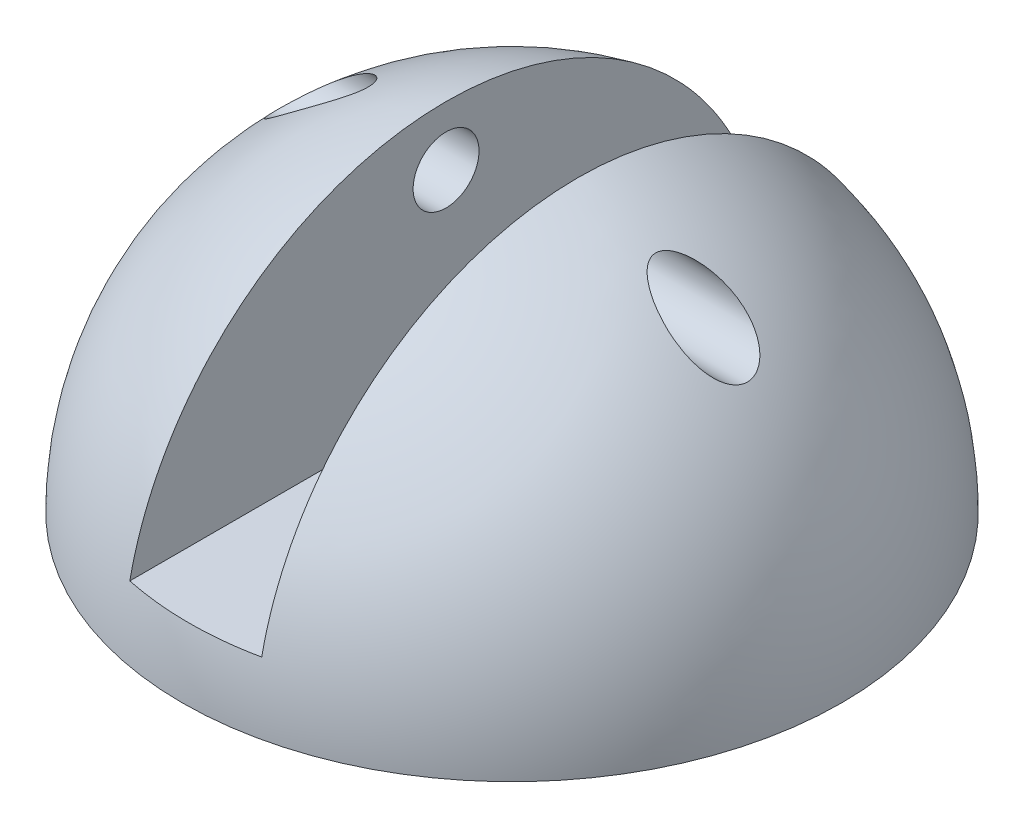
ISO-10303-21;
HEADER;
FILE_DESCRIPTION(('STEP AP214'),'2;1');
FILE_NAME('part.step','',(''),(''),'','','');
FILE_SCHEMA(('AUTOMOTIVE_DESIGN { 1 0 10303 214 1 1 1 1 }'));
ENDSEC;
DATA;
#1=APPLICATION_CONTEXT('core data for automotive mechanical design processes');
#2=APPLICATION_PROTOCOL_DEFINITION('international standard','automotive_design',2000,#1);
#3=PRODUCT_CONTEXT('',#1,'mechanical');
#4=PRODUCT('Part','Part','',(#3));
#5=PRODUCT_RELATED_PRODUCT_CATEGORY('part','',(#4));
#6=PRODUCT_DEFINITION_FORMATION('','',#4);
#7=PRODUCT_DEFINITION_CONTEXT('part definition',#1,'design');
#8=PRODUCT_DEFINITION('design','',#6,#7);
#9=PRODUCT_DEFINITION_SHAPE('','',#8);
#10=(LENGTH_UNIT() NAMED_UNIT(*) SI_UNIT(.MILLI.,.METRE.));
#11=(NAMED_UNIT(*) PLANE_ANGLE_UNIT() SI_UNIT($,.RADIAN.));
#12=(NAMED_UNIT(*) SI_UNIT($,.STERADIAN.) SOLID_ANGLE_UNIT());
#13=UNCERTAINTY_MEASURE_WITH_UNIT(LENGTH_MEASURE(1.E-05),#10,'distance_accuracy_value','');
#14=(GEOMETRIC_REPRESENTATION_CONTEXT(3) GLOBAL_UNCERTAINTY_ASSIGNED_CONTEXT((#13)) GLOBAL_UNIT_ASSIGNED_CONTEXT((#10,
#11,#12)) REPRESENTATION_CONTEXT('',''));
#15=CARTESIAN_POINT('',(0.,0.,0.));
#16=DIRECTION('',(0.,0.,1.));
#17=DIRECTION('',(1.,0.,0.));
#18=AXIS2_PLACEMENT_3D('',#15,#16,#17);
#19=CARTESIAN_POINT('',(0.,0.,0.));
#20=DIRECTION('',(0.,0.,-1.));
#21=DIRECTION('',(-1.,0.,0.));
#22=AXIS2_PLACEMENT_3D('',#19,#20,#21);
#23=SPHERICAL_SURFACE('',#22,50.);
#24=CARTESIAN_POINT('',(0.,0.,0.));
#25=DIRECTION('',(0.,-1.,0.));
#26=DIRECTION('',(0.,0.,-1.));
#27=AXIS2_PLACEMENT_3D('',#24,#25,#26);
#28=CIRCLE('',#27,50.);
#29=CARTESIAN_POINT('',(0.,0.,-50.));
#30=VERTEX_POINT('',#29);
#31=EDGE_CURVE('E78',#30,#30,#28,.T.);
#32=ORIENTED_EDGE('',*,*,#31,.F.);
#33=EDGE_LOOP('',(#32));
#34=FACE_BOUND('',#33,.T.);
#35=CARTESIAN_POINT('',(0.,9.99999999999966,0.));
#36=DIRECTION('',(0.,1.,0.));
#37=DIRECTION('',(0.,0.,1.));
#38=AXIS2_PLACEMENT_3D('',#35,#36,#37);
#39=CIRCLE('',#38,48.9897948556636);
#40=CARTESIAN_POINT('',(-10.,9.99999999999966,47.9583152331273));
#41=VERTEX_POINT('',#40);
#42=CARTESIAN_POINT('',(10.,9.99999999999966,47.9583152331273));
#43=VERTEX_POINT('',#42);
#44=EDGE_CURVE('E47',#41,#43,#39,.T.);
#45=ORIENTED_EDGE('',*,*,#44,.F.);
#46=CARTESIAN_POINT('',(-10.,0.,0.));
#47=DIRECTION('',(-1.,0.,0.));
#48=DIRECTION('',(0.,0.,1.));
#49=AXIS2_PLACEMENT_3D('',#46,#47,#48);
#50=CIRCLE('',#49,48.9897948556636);
#51=CARTESIAN_POINT('',(-10.,9.99999999999966,-47.9583152331273));
#52=VERTEX_POINT('',#51);
#53=EDGE_CURVE('E11',#41,#52,#50,.T.);
#54=ORIENTED_EDGE('',*,*,#53,.T.);
#55=CARTESIAN_POINT('',(10.,9.99999999999966,-47.9583152331273));
#56=VERTEX_POINT('',#55);
#57=EDGE_CURVE('E69',#56,#52,#39,.T.);
#58=ORIENTED_EDGE('',*,*,#57,.F.);
#59=CARTESIAN_POINT('',(10.,0.,0.));
#60=DIRECTION('',(-1.,0.,0.));
#61=DIRECTION('',(0.,0.,1.));
#62=AXIS2_PLACEMENT_3D('',#59,#60,#61);
#63=CIRCLE('',#62,48.9897948556636);
#64=EDGE_CURVE('E57',#43,#56,#63,.T.);
#65=ORIENTED_EDGE('',*,*,#64,.F.);
#66=EDGE_LOOP('',(#45,#54,#58,#65));
#67=FACE_BOUND('',#66,.T.);
#68=CARTESIAN_POINT('',(22.2703887354778,44.7378723196338,-1.59767514934802));
#69=CARTESIAN_POINT('',(22.1932371073026,44.7808269800892,-1.47029758972301));
#70=CARTESIAN_POINT('',(22.1226635356232,44.8198942912857,-1.33751205586922));
#71=CARTESIAN_POINT('',(21.9989908476105,44.888103300807,-1.06140079136982));
#72=CARTESIAN_POINT('',(21.9458862970053,44.917248085935,-0.918078355555511));
#73=CARTESIAN_POINT('',(21.8826461775311,44.951878040558,-0.696149161945864));
#74=CARTESIAN_POINT('',(21.8642438160011,44.9619384334918,-0.620552433932894));
#75=CARTESIAN_POINT('',(21.8336241090407,44.9786636840814,-0.467762571480297));
#76=CARTESIAN_POINT('',(21.8214037008484,44.985330223185,-0.390570247326498));
#77=CARTESIAN_POINT('',(21.8035473771076,44.995067548328,-0.235257470057853));
#78=CARTESIAN_POINT('',(21.7979061784318,44.998141219457,-0.157137812591373));
#79=CARTESIAN_POINT('',(21.7933685739871,45.0006135647215,-0.000668281136261055));
#80=CARTESIAN_POINT('',(21.7944715556223,45.0000125726386,0.0776815712968481));
#81=CARTESIAN_POINT('',(21.8069193827905,44.9932296622164,0.294794809460584));
#82=CARTESIAN_POINT('',(21.8255707959373,44.9830662766457,0.433092582998383));
#83=CARTESIAN_POINT('',(21.8823553595961,44.9520411685981,0.704290479350222));
#84=CARTESIAN_POINT('',(21.9205053829803,44.9311701803753,0.837185819538073));
#85=CARTESIAN_POINT('',(22.0302366544443,44.8709082436096,1.14312257670589));
#86=CARTESIAN_POINT('',(22.1089678695213,44.8275202832641,1.31278918719204));
#87=CARTESIAN_POINT('',(22.2885257456511,44.7278707201971,1.63585518158643));
#88=CARTESIAN_POINT('',(22.3894054492226,44.671578198334,1.78921417949891));
#89=CARTESIAN_POINT('',(22.5880885707638,44.5598302617343,2.05549997819579));
#90=CARTESIAN_POINT('',(22.6835123947038,44.5058518533443,2.1708729811569));
#91=CARTESIAN_POINT('',(22.8823666440172,44.3925898182448,2.39177272521764));
#92=CARTESIAN_POINT('',(22.9858025511915,44.3333025548554,2.49729261406586));
#93=CARTESIAN_POINT('',(23.1988452702967,44.2103118554716,2.69949993929237));
#94=CARTESIAN_POINT('',(23.3084623344816,44.1466010393994,2.7961719597323));
#95=CARTESIAN_POINT('',(23.5323374051798,44.0155207092283,2.98135074090985));
#96=CARTESIAN_POINT('',(23.6465971017686,43.94814985969,3.06985448906138));
#97=CARTESIAN_POINT('',(23.9776198328422,43.7514977533219,3.31169584090559));
#98=CARTESIAN_POINT('',(24.1987406407604,43.6183928166008,3.45599542702523));
#99=CARTESIAN_POINT('',(24.6488466828835,43.3435647640593,3.72252437692595));
#100=CARTESIAN_POINT('',(24.877838043055,43.2018348658041,3.84473606360148));
#101=CARTESIAN_POINT('',(25.341346806713,42.9108743416439,4.0694781242359));
#102=CARTESIAN_POINT('',(25.5758741507814,42.7616295749418,4.17196950023823));
#103=CARTESIAN_POINT('',(26.0480945538486,42.4569070198507,4.3583807749894));
#104=CARTESIAN_POINT('',(26.2857869728807,42.3014304790983,4.44230436939418));
#105=CARTESIAN_POINT('',(26.8515694671044,41.9262515174737,4.62030813795353));
#106=CARTESIAN_POINT('',(27.1805053187049,41.7041066883031,4.7066199131529));
#107=CARTESIAN_POINT('',(27.8393715633996,41.2509754874539,4.84678206382751));
#108=CARTESIAN_POINT('',(28.1693023420851,41.0199851242781,4.90061759656104));
#109=CARTESIAN_POINT('',(28.8274742057775,40.5510615210855,4.97520198971617));
#110=CARTESIAN_POINT('',(29.1557166785373,40.3131356581515,4.99598478722138));
#111=CARTESIAN_POINT('',(29.808528202309,39.8319757531166,5.00296229200358));
#112=CARTESIAN_POINT('',(30.13309909203,39.5887445644476,4.9891751588886));
#113=CARTESIAN_POINT('',(30.6720220074217,39.1784303853475,4.93486401539447));
#114=CARTESIAN_POINT('',(30.8880527099102,39.0121763261803,4.90443583042055));
#115=CARTESIAN_POINT('',(31.3163986695668,38.6791126024447,4.82540760044989));
#116=CARTESIAN_POINT('',(31.5287138763847,38.5123029303833,4.7768073093944));
#117=CARTESIAN_POINT('',(31.9481170653401,38.1795216550692,4.66014005100323));
#118=CARTESIAN_POINT('',(32.1552121943319,38.0135491862774,4.59210147109201));
#119=CARTESIAN_POINT('',(32.562932736478,37.683711543497,4.43488223174957));
#120=CARTESIAN_POINT('',(32.763560661064,37.5198455667193,4.34570989441607));
#121=CARTESIAN_POINT('',(33.0919562110158,37.2492483835819,4.17729108435887));
#122=CARTESIAN_POINT('',(33.2220479040309,37.1413975483447,4.10437397340127));
#123=CARTESIAN_POINT('',(33.477605866854,36.9283286195732,3.94744894321753));
#124=CARTESIAN_POINT('',(33.6030712980459,36.8231110044705,3.86343902568655));
#125=CARTESIAN_POINT('',(33.9708633663901,36.5130007713955,3.59385972064821));
#126=CARTESIAN_POINT('',(34.2051290679359,36.3132019585917,3.39047182474193));
#127=CARTESIAN_POINT('',(34.5803645048668,35.9902935616761,2.99470668234818));
#128=CARTESIAN_POINT('',(34.7292603417062,35.8612172456729,2.81472220861632));
#129=CARTESIAN_POINT('',(35.0034864066405,35.6221829493116,2.42622504747944));
#130=CARTESIAN_POINT('',(35.1288510314391,35.5121970815273,2.21775478223201));
#131=CARTESIAN_POINT('',(35.3255475683064,35.3389166361376,1.8196283077491));
#132=CARTESIAN_POINT('',(35.4026941347118,35.2706688873225,1.63506468495164));
#133=CARTESIAN_POINT('',(35.5004850105077,35.1839577527142,1.34751626343982));
#134=CARTESIAN_POINT('',(35.5300986839326,35.1576597606774,1.24985861747446));
#135=CARTESIAN_POINT('',(35.5828658227327,35.1107544835547,1.05149722043549));
#136=CARTESIAN_POINT('',(35.606022096831,35.0901447243442,0.950794814909618));
#137=CARTESIAN_POINT('',(35.6455875816641,35.0549060147732,0.746254289325444));
#138=CARTESIAN_POINT('',(35.6619463419351,35.0403217897215,0.642398653705174));
#139=CARTESIAN_POINT('',(35.6873280496736,35.0176847340287,0.433131784281681));
#140=CARTESIAN_POINT('',(35.6963543500999,35.009628918106,0.327721283958251));
#141=CARTESIAN_POINT('',(35.7068839953567,35.0002307930304,0.116234805018754));
#142=CARTESIAN_POINT('',(35.7083880306413,34.9988878677143,0.0101588883748826));
#143=CARTESIAN_POINT('',(35.7038412051735,35.002946604645,-0.201694999894623));
#144=CARTESIAN_POINT('',(35.6977908905664,35.0083477793238,-0.307472992504733));
#145=CARTESIAN_POINT('',(35.679313558212,35.0248332327209,-0.506557558838488));
#146=CARTESIAN_POINT('',(35.6676358662183,35.0352495884531,-0.599990497112976));
#147=CARTESIAN_POINT('',(35.6385651906904,35.0611609792532,-0.785259070256627));
#148=CARTESIAN_POINT('',(35.6211705357361,35.0766574995624,-0.877094229719242));
#149=CARTESIAN_POINT('',(35.5608130999084,35.1303777468839,-1.1493095961018));
#150=CARTESIAN_POINT('',(35.5096645685644,35.175843167763,-1.3265265219245));
#151=CARTESIAN_POINT('',(35.3710318338157,35.2987015057734,-1.71787049967341));
#152=CARTESIAN_POINT('',(35.2773402650105,35.3815060514602,-1.92806632007382));
#153=CARTESIAN_POINT('',(35.0651021541504,35.5681239163992,-2.32526213256208));
#154=CARTESIAN_POINT('',(34.9465131109388,35.6719731492399,-2.51222157889663));
#155=CARTESIAN_POINT('',(34.6397144024402,35.9390226422114,-2.93124235944109));
#156=CARTESIAN_POINT('',(34.4424798838545,36.109489480462,-3.1520665251487));
#157=CARTESIAN_POINT('',(34.1278642155705,36.3787511178332,-3.45030057294448));
#158=CARTESIAN_POINT('',(34.019709672957,36.4708959606957,-3.54431383730646));
#159=CARTESIAN_POINT('',(33.7980894144304,36.6587673328217,-3.72194197629258));
#160=CARTESIAN_POINT('',(33.6846247470868,36.7544931542207,-3.80555889201729));
#161=CARTESIAN_POINT('',(33.3939767935614,36.9984113158597,-4.00327742185686));
#162=CARTESIAN_POINT('',(33.2139426230188,37.1483474143213,-4.11103709896264));
#163=CARTESIAN_POINT('',(32.846102633838,37.4520927151717,-4.30589543054493));
#164=CARTESIAN_POINT('',(32.6582930357375,37.6059037865348,-4.39298389537814));
#165=CARTESIAN_POINT('',(32.2764837276901,37.9158135054794,-4.54821199882102));
#166=CARTESIAN_POINT('',(32.0824771639451,38.0719145748323,-4.6163297858133));
#167=CARTESIAN_POINT('',(31.6898481779436,38.3849011782279,-4.73491854760452));
#168=CARTESIAN_POINT('',(31.4912259667728,38.5417866761401,-4.78539032771432));
#169=CARTESIAN_POINT('',(30.999749242035,38.9262518315297,-4.88903894700845));
#170=CARTESIAN_POINT('',(30.7048805649582,39.1537333104055,-4.93312712531091));
#171=CARTESIAN_POINT('',(30.1099927769765,39.6059615680581,-4.98965691999668));
#172=CARTESIAN_POINT('',(29.8099713243994,39.8307070196791,-5.00208374309377));
#173=CARTESIAN_POINT('',(29.2061422102319,40.2761576284949,-4.99734525020786));
#174=CARTESIAN_POINT('',(28.9023274058673,40.496852258474,-4.98011154001538));
#175=CARTESIAN_POINT('',(28.2934276223237,40.9321827839938,-4.91725471823387));
#176=CARTESIAN_POINT('',(27.9883429496682,41.146820054232,-4.87163810310037));
#177=CARTESIAN_POINT('',(27.3709500878152,41.5741095268398,-4.75107320907383));
#178=CARTESIAN_POINT('',(27.0586522858076,41.7865774839854,-4.67541914939943));
#179=CARTESIAN_POINT('',(26.43639222736,42.202673843904,-4.49441584949375));
#180=CARTESIAN_POINT('',(26.1264313498628,42.4062973209125,-4.38905030065363));
#181=CARTESIAN_POINT('',(25.6659557384647,42.703528685448,-4.20765199947412));
#182=CARTESIAN_POINT('',(25.5133406792021,42.801156069057,-4.14336114278696));
#183=CARTESIAN_POINT('',(25.2099680108725,42.9935061530879,-4.00660141718819));
#184=CARTESIAN_POINT('',(25.0592101073732,43.0882293175823,-3.93413386360453));
#185=CARTESIAN_POINT('',(24.7603218729823,43.2743596404267,-3.78062224214648));
#186=CARTESIAN_POINT('',(24.6121885808786,43.3657706759714,-3.69958866791045));
#187=CARTESIAN_POINT('',(24.3191318001564,43.5450161101045,-3.52820670826554));
#188=CARTESIAN_POINT('',(24.1742085319163,43.6328502634738,-3.43785768571485));
#189=CARTESIAN_POINT('',(23.904064492756,43.7951491060684,-3.25729110979437));
#190=CARTESIAN_POINT('',(23.7784048325624,43.8700338779334,-3.16811083964346));
#191=CARTESIAN_POINT('',(23.5315857754844,44.0159960513736,-2.9809160718233));
#192=CARTESIAN_POINT('',(23.4104245329501,44.0870750198398,-2.88290525507401));
#193=CARTESIAN_POINT('',(23.1745187509025,44.2244441023341,-2.6775488767696));
#194=CARTESIAN_POINT('',(23.059747445413,44.2907545951867,-2.57024796816145));
#195=CARTESIAN_POINT('',(22.8380790435616,44.4179299278416,-2.34491366734574));
#196=CARTESIAN_POINT('',(22.7311746118234,44.4787998523057,-2.22689050850566));
#197=CARTESIAN_POINT('',(22.5647530015668,44.5729518281618,-2.02378554622927));
#198=CARTESIAN_POINT('',(22.5020792359407,44.6082504136681,-1.94222491845448));
#199=CARTESIAN_POINT('',(22.3819815221843,44.675631398133,-1.77389382597112));
#200=CARTESIAN_POINT('',(22.324563429469,44.7077102136523,-1.68711772466689));
#201=CARTESIAN_POINT('',(22.2703887354778,44.7378723196338,-1.59767514934802));
#202=B_SPLINE_CURVE_WITH_KNOTS('',3,(#68,#69,#70,#71,#72,#73,#74,#75,#76,#77,#78,#79,#80,#81,
#82,#83,#84,#85,#86,#87,#88,#89,#90,#91,#92,#93,#94,#95,#96,#97,#98,#99,#100,#101,#102,#103,
#104,#105,#106,#107,#108,#109,#110,#111,#112,#113,#114,#115,#116,#117,#118,#119,#120,#121,#122,
#123,#124,#125,#126,#127,#128,#129,#130,#131,#132,#133,#134,#135,#136,#137,#138,#139,#140,#141,
#142,#143,#144,#145,#146,#147,#148,#149,#150,#151,#152,#153,#154,#155,#156,#157,#158,#159,#160,
#161,#162,#163,#164,#165,#166,#167,#168,#169,#170,#171,#172,#173,#174,#175,#176,#177,#178,#179,
#180,#181,#182,#183,#184,#185,#186,#187,#188,#189,#190,#191,#192,#193,#194,#195,#196,#197,#198,
#199,#200,#201),.UNSPECIFIED.,.T.,.F.,(4,2,2,2,2,2,2,2,2,2,2,2,2,2,2,2,2,2,2,2,2,2,2,2,2,2,2,2,
2,2,2,2,2,2,2,2,2,2,2,2,2,2,2,2,2,2,2,2,2,2,2,2,2,2,2,2,2,2,2,2,2,2,2,2,2,2,4),(0.,
0.4647600920896,0.929375469356782,1.16444824737434,1.3994044475447,1.63417184691304,
1.86891792191552,2.28646206650012,2.70436814083658,3.2771539094264,3.85132668005869,
4.32812690024783,4.80525627468966,5.28320174245341,5.76132278536721,6.64697660676567,
7.53333611466659,8.4214308249856,9.30934861319841,10.5264309886339,11.744069191302,
12.960456368014,14.1762047095937,14.9985360268018,15.8208784791609,16.6420260789052,
17.4628508610265,18.0145883218938,18.566425311016,19.6678545385663,20.4659597728994,
21.2628891350667,21.8942139191177,22.2100255907834,22.5256996813612,22.8436765399634,
23.1615079133665,23.4793101131125,23.7970893385261,24.0809594748657,24.3649126778507,
24.9324399992871,25.6622087215057,26.3932334722939,27.412170924689,27.9229910889822,
28.4337108057738,29.2062006353367,29.9790704679777,30.7528268928811,31.5265480012497,
32.6499867426112,33.7739502974405,34.9005090730091,36.0268100896167,37.1813102528698,
38.3364453578742,38.9129976603849,39.4894573488375,40.0652188652821,40.6410197878161,
41.1547040306413,41.6681751316147,42.1793023691513,42.6899468088858,43.0159353647277,
43.3422827972292),.UNSPECIFIED.);
#203=CARTESIAN_POINT('',(22.2703887354778,44.7378723196338,-1.59767514934802));
#204=VERTEX_POINT('',#203);
#205=EDGE_CURVE('E81',#204,#204,#202,.T.);
#206=ORIENTED_EDGE('',*,*,#205,.F.);
#207=EDGE_LOOP('',(#206));
#208=FACE_BOUND('',#207,.T.);
#209=CARTESIAN_POINT('',(-34.6976388227904,35.8884214661139,-2.84515991547257));
#210=CARTESIAN_POINT('',(-34.826095719268,35.7769955480327,-2.6841393471322));
#211=CARTESIAN_POINT('',(-34.9464220583906,35.6719959941146,-2.51223500844265));
#212=CARTESIAN_POINT('',(-35.1662348126824,35.4793499226744,-2.14623265898091));
#213=CARTESIAN_POINT('',(-35.2657256598312,35.391699714939,-1.95213938169072));
#214=CARTESIAN_POINT('',(-35.3954058547473,35.2770894829889,-1.64507909224745));
#215=CARTESIAN_POINT('',(-35.4355505444444,35.2415385379399,-1.53940240753133));
#216=CARTESIAN_POINT('',(-35.5082756392076,35.1770460022751,-1.32354673854726));
#217=CARTESIAN_POINT('',(-35.5408601501787,35.1481008242324,-1.21337023653175));
#218=CARTESIAN_POINT('',(-35.5977450920639,35.0975169519101,-0.989361575403468));
#219=CARTESIAN_POINT('',(-35.6220527516713,35.0758718821462,-0.875532701716615));
#220=CARTESIAN_POINT('',(-35.661831981049,35.0404267267474,-0.64514044368587));
#221=CARTESIAN_POINT('',(-35.677305141421,35.0266252289237,-0.528577555522781));
#222=CARTESIAN_POINT('',(-35.6976045126207,35.0085139870204,-0.309145927973961));
#223=CARTESIAN_POINT('',(-35.7035510928339,35.0032055544983,-0.206461267951517));
#224=CARTESIAN_POINT('',(-35.7083268315011,34.9989425163364,-0.000798961699834068));
#225=CARTESIAN_POINT('',(-35.707156582021,34.9999873821508,0.102178659444868));
#226=CARTESIAN_POINT('',(-35.6977206281979,35.0084095590582,0.307538702524062));
#227=CARTESIAN_POINT('',(-35.6894556996604,35.015786177772,0.409921188304443));
#228=CARTESIAN_POINT('',(-35.6660157196598,35.0366931880449,0.613227496971502));
#229=CARTESIAN_POINT('',(-35.650840730965,35.050223523706,0.714151333099373));
#230=CARTESIAN_POINT('',(-35.5984159036745,35.0969245564071,0.997084933661423));
#231=CARTESIAN_POINT('',(-35.5533085521657,35.1370661469212,1.17658007089672));
#232=CARTESIAN_POINT('',(-35.4434299723018,35.2345783460577,1.52430317542074));
#233=CARTESIAN_POINT('',(-35.3786528897064,35.2919540839704,1.69252777007348));
#234=CARTESIAN_POINT('',(-35.2023612011358,35.447554061654,2.08217141123316));
#235=CARTESIAN_POINT('',(-35.0825798511996,35.5528749051367,2.29703450755468));
#236=CARTESIAN_POINT('',(-34.8178961738254,35.7841466700606,2.69824386230311));
#237=CARTESIAN_POINT('',(-34.6729397019119,35.9101420235397,2.8845269927827));
#238=CARTESIAN_POINT('',(-34.2966288352076,36.2348763303451,3.30485069408105));
#239=CARTESIAN_POINT('',(-34.0552611311231,36.4412870313216,3.52401503229395));
#240=CARTESIAN_POINT('',(-33.674607386334,36.7629653819323,3.81345841730917));
#241=CARTESIAN_POINT('',(-33.5444541496937,36.8723411426305,3.903473796112));
#242=CARTESIAN_POINT('',(-33.2789071289789,37.0941487787688,4.07128363795569));
#243=CARTESIAN_POINT('',(-33.143513415742,37.2065806128927,4.14907826611779));
#244=CARTESIAN_POINT('',(-32.7967467010384,37.4927145172847,4.33074889620281));
#245=CARTESIAN_POINT('',(-32.5825619912964,37.6678008039831,4.42707798537047));
#246=CARTESIAN_POINT('',(-32.146780590886,38.0204005020356,4.5955819340006));
#247=CARTESIAN_POINT('',(-31.925180248628,38.1979150829131,4.66774469514531));
#248=CARTESIAN_POINT('',(-31.4761040887173,38.553817070161,4.78999055544983));
#249=CARTESIAN_POINT('',(-31.2486194024323,38.7322054206821,4.84003799049272));
#250=CARTESIAN_POINT('',(-30.7895680127511,39.0881902183221,4.91953806745403));
#251=CARTESIAN_POINT('',(-30.5580015866401,39.2657867182148,4.94899210286062));
#252=CARTESIAN_POINT('',(-30.007179151539,39.6833757660012,4.9958522965921));
#253=CARTESIAN_POINT('',(-29.6866226680999,39.9226018327379,5.00499664751553));
#254=CARTESIAN_POINT('',(-29.0422188323222,40.3956680181564,4.9899372848871));
#255=CARTESIAN_POINT('',(-28.7183700504507,40.629505639414,4.96571841219171));
#256=CARTESIAN_POINT('',(-28.0694508563441,41.090140589815,4.88531284642498));
#257=CARTESIAN_POINT('',(-27.7443799888145,41.3169349258408,4.82911275345375));
#258=CARTESIAN_POINT('',(-27.0954120472401,41.7617976347052,4.6851610401584));
#259=CARTESIAN_POINT('',(-26.7715145052842,41.9798699419024,4.59742382820969));
#260=CARTESIAN_POINT('',(-26.2301723406629,42.3378279736926,4.42273291112858));
#261=CARTESIAN_POINT('',(-26.0117212789872,42.4804688861068,4.34445303364425));
#262=CARTESIAN_POINT('',(-25.5776225295032,42.7604036480079,4.17219273122693));
#263=CARTESIAN_POINT('',(-25.361974283631,42.897698573137,4.07821548503127));
#264=CARTESIAN_POINT('',(-24.9354041266896,43.1658872108562,3.87369796798451));
#265=CARTESIAN_POINT('',(-24.7244717393491,43.2967960812867,3.76319973051094));
#266=CARTESIAN_POINT('',(-24.3089481222123,43.5514772730478,3.52385399873753));
#267=CARTESIAN_POINT('',(-24.1043532249986,43.6752537588688,3.39501736762895));
#268=CARTESIAN_POINT('',(-23.7003225377174,43.9167024013798,3.11360903233595));
#269=CARTESIAN_POINT('',(-23.5010728663232,44.0342020509704,2.96061263424633));
#270=CARTESIAN_POINT('',(-23.213557547102,44.2017500761332,2.71205470541933));
#271=CARTESIAN_POINT('',(-23.1195898561018,44.2561619051882,2.62600053161353));
#272=CARTESIAN_POINT('',(-22.9365018100535,44.3615657226085,2.44694442523417));
#273=CARTESIAN_POINT('',(-22.84738044324,44.4125584253058,2.35394395253445));
#274=CARTESIAN_POINT('',(-22.6280912863358,44.5373392578662,2.10732397557699));
#275=CARTESIAN_POINT('',(-22.5021630600277,44.6083237920115,1.94839141630825));
#276=CARTESIAN_POINT('',(-22.27228242218,44.7369826570462,1.6104353635383));
#277=CARTESIAN_POINT('',(-22.1682805288507,44.7946869853422,1.43145853425617));
#278=CARTESIAN_POINT('',(-22.0191587532414,44.8770058735063,1.1105578578773));
#279=CARTESIAN_POINT('',(-21.965741307901,44.9063509395525,0.973756823713372));
#280=CARTESIAN_POINT('',(-21.8789418866297,44.9539225329249,0.69207846912857));
#281=CARTESIAN_POINT('',(-21.8455348262269,44.9721629811683,0.547211510104644));
#282=CARTESIAN_POINT('',(-21.8020910799258,44.995866727197,0.251778009904892));
#283=CARTESIAN_POINT('',(-21.7922270899627,45.0012356092103,0.101177534898442));
#284=CARTESIAN_POINT('',(-21.7976485194227,44.9982815430247,-0.199446157185594));
#285=CARTESIAN_POINT('',(-21.8129370355563,44.989956908916,-0.349469300904253));
#286=CARTESIAN_POINT('',(-21.8641540650303,44.9619914000227,-0.629769922306807));
#287=CARTESIAN_POINT('',(-21.8979755583229,44.9435052126131,-0.760566195873255));
#288=CARTESIAN_POINT('',(-21.9817210568399,44.8975711934462,-1.01516328574899));
#289=CARTESIAN_POINT('',(-22.0316522327151,44.8701193708892,-1.13896095798825));
#290=CARTESIAN_POINT('',(-22.1796011963627,44.7884195039962,-1.45306297857488));
#291=CARTESIAN_POINT('',(-22.2882018855201,44.7281298080484,-1.63678060398589));
#292=CARTESIAN_POINT('',(-22.5281905229782,44.5936887656672,-1.98312266808929));
#293=CARTESIAN_POINT('',(-22.6596508650026,44.5194933215218,-2.14567713585036));
#294=CARTESIAN_POINT('',(-22.9206715359217,44.3707221732112,-2.43302636098774));
#295=CARTESIAN_POINT('',(-23.048518312284,44.2972902622819,-2.560009033551));
#296=CARTESIAN_POINT('',(-23.3125923769716,44.1442560861652,-2.80098856981158));
#297=CARTESIAN_POINT('',(-23.4488260713813,44.0646490919586,-2.91497531260956));
#298=CARTESIAN_POINT('',(-23.7275273149646,43.9002989159611,-3.13147846140885));
#299=CARTESIAN_POINT('',(-23.8700043903056,43.8155478036086,-3.23397642552974));
#300=CARTESIAN_POINT('',(-24.1594735717693,43.6417599883902,-3.42849762720753));
#301=CARTESIAN_POINT('',(-24.3064672275999,43.5527218084879,-3.52051721733977));
#302=CARTESIAN_POINT('',(-24.5882146432351,43.380467728957,-3.68580351547349));
#303=CARTESIAN_POINT('',(-24.7226366118265,43.2976196300138,-3.76002486794346));
#304=CARTESIAN_POINT('',(-24.9935783515218,43.1292426807759,-3.90127011637214));
#305=CARTESIAN_POINT('',(-25.1300984251905,43.0437134419532,-3.9682929628976));
#306=CARTESIAN_POINT('',(-25.5422167693158,42.7833818214875,-4.15922959039919));
#307=CARTESIAN_POINT('',(-25.8202662065244,42.6049008353466,-4.27294986566721));
#308=CARTESIAN_POINT('',(-26.3803472625765,42.2394488763787,-4.47532286893922));
#309=CARTESIAN_POINT('',(-26.6623838350052,42.0524665578807,-4.56394088430142));
#310=CARTESIAN_POINT('',(-27.2281068094631,41.6713773053579,-4.71684501412162));
#311=CARTESIAN_POINT('',(-27.511792752288,41.477272281292,-4.78113759991025));
#312=CARTESIAN_POINT('',(-28.0946106708361,41.0722785438643,-4.88839761473306));
#313=CARTESIAN_POINT('',(-28.3937518433949,40.8610488807161,-4.93003037199401));
#314=CARTESIAN_POINT('',(-28.9906455609308,40.4328944604155,-4.98590178948031));
#315=CARTESIAN_POINT('',(-29.2883977628636,40.2159683758615,-5.00013400626794));
#316=CARTESIAN_POINT('',(-29.880193761206,39.7782677325203,-4.99986434046028));
#317=CARTESIAN_POINT('',(-30.1742436036098,39.5575014054146,-4.98541783778094));
#318=CARTESIAN_POINT('',(-30.7572340101246,39.1134675693393,-4.92587251918655));
#319=CARTESIAN_POINT('',(-31.046177061884,38.8902013698396,-4.88078907457874));
#320=CARTESIAN_POINT('',(-31.5115920328627,38.525651504813,-4.77992966675107));
#321=CARTESIAN_POINT('',(-31.6903244424205,38.3844330981825,-4.73419352028319));
#322=CARTESIAN_POINT('',(-32.0440262030643,38.1026453256734,-4.62846539682761));
#323=CARTESIAN_POINT('',(-32.2189964272167,37.962075815288,-4.56847676712303));
#324=CARTESIAN_POINT('',(-32.5641742684231,37.6825541510999,-4.43323150818178));
#325=CARTESIAN_POINT('',(-32.7343837834877,37.543601366023,-4.35798106521221));
#326=CARTESIAN_POINT('',(-33.0688683477573,37.2684736900263,-4.19102091013103));
#327=CARTESIAN_POINT('',(-33.2331449767092,37.1322980639007,-4.09931561884354));
#328=CARTESIAN_POINT('',(-33.5132619207817,36.8984447032746,-3.92376393143696));
#329=CARTESIAN_POINT('',(-33.6307721007394,36.7998042199739,-3.84387589109474));
#330=CARTESIAN_POINT('',(-33.8607833399044,36.6057579314554,-3.67366289963291));
#331=CARTESIAN_POINT('',(-33.9732833229859,36.510352822194,-3.58333572115584));
#332=CARTESIAN_POINT('',(-34.3014096693466,36.2307582863466,-3.29607069884114));
#333=CARTESIAN_POINT('',(-34.5083513681719,36.0526129497205,-3.08243151675022));
#334=CARTESIAN_POINT('',(-34.6976388227904,35.8884214661139,-2.84515991547257));
#335=B_SPLINE_CURVE_WITH_KNOTS('',3,(#209,#210,#211,#212,#213,#214,#215,#216,#217,#218,#219,
#220,#221,#222,#223,#224,#225,#226,#227,#228,#229,#230,#231,#232,#233,#234,#235,#236,#237,#238,
#239,#240,#241,#242,#243,#244,#245,#246,#247,#248,#249,#250,#251,#252,#253,#254,#255,#256,#257,
#258,#259,#260,#261,#262,#263,#264,#265,#266,#267,#268,#269,#270,#271,#272,#273,#274,#275,#276,
#277,#278,#279,#280,#281,#282,#283,#284,#285,#286,#287,#288,#289,#290,#291,#292,#293,#294,#295,
#296,#297,#298,#299,#300,#301,#302,#303,#304,#305,#306,#307,#308,#309,#310,#311,#312,#313,#314,
#315,#316,#317,#318,#319,#320,#321,#322,#323,#324,#325,#326,#327,#328,#329,#330,#331,#332,#333,
#334),.UNSPECIFIED.,.T.,.F.,(4,2,2,2,2,2,2,2,2,2,2,2,2,2,2,2,2,2,2,2,2,2,2,2,2,2,2,2,2,2,2,2,2,
2,2,2,2,2,2,2,2,2,2,2,2,2,2,2,2,2,2,2,2,2,2,2,2,2,2,2,2,2,4),(0.,0.701914885121115,
1.40368031184021,1.75876755785554,2.11366150352288,2.46824469824516,2.82276403211519,
3.13131551925285,3.43984133761596,3.74833342288252,4.05682270598718,4.62238723020821,
5.18812024688432,5.98638418124317,6.78638670820826,7.93718294413736,8.513974417831,
9.09075809750895,9.96824170299068,10.8461639460876,11.7254968427413,12.6047702320461,
13.8034117998916,15.0025981704261,16.202287361712,17.4014291457503,18.2181416151208,
19.0346888992265,19.8491929714879,20.6632165451744,21.4935875275659,21.9089843343905,
22.3242940833786,22.9669697140277,23.6081790965836,24.0558388477097,24.5029362439318,
24.9533032967286,25.4037258016851,25.8112005418874,26.2188569057415,26.880347996715,
27.543973424572,28.1268854972882,28.7102484702758,29.2945348427082,29.8790239820617,
30.4022556659886,30.9255635259355,31.9725967198962,33.0210708122842,34.069265781083,
35.173901410607,36.2787967715742,37.3815606045849,38.4837715619556,39.1803791997833,
39.8768233964754,40.5729858566658,41.2689615624032,41.7874771025958,42.306103481357,
43.3404090391493),.UNSPECIFIED.);
#336=CARTESIAN_POINT('',(-34.6976388227904,35.8884214661139,-2.84515991547257));
#337=VERTEX_POINT('',#336);
#338=EDGE_CURVE('E76',#337,#337,#335,.T.);
#339=ORIENTED_EDGE('',*,*,#338,.F.);
#340=EDGE_LOOP('',(#339));
#341=FACE_BOUND('',#340,.T.);
#342=ADVANCED_FACE('F38',(#34,#67,#208,#341),#23,.T.);
#343=CARTESIAN_POINT('',(0.,0.,0.));
#344=DIRECTION('',(0.,1.,0.));
#345=DIRECTION('',(0.,0.,-1.));
#346=AXIS2_PLACEMENT_3D('',#343,#344,#345);
#347=PLANE('',#346);
#348=ORIENTED_EDGE('',*,*,#31,.T.);
#349=EDGE_LOOP('',(#348));
#350=FACE_BOUND('',#349,.T.);
#351=ADVANCED_FACE('F93',(#350),#347,.F.);
#352=CARTESIAN_POINT('',(0.,9.99999999999966,50.));
#353=DIRECTION('',(0.,1.,0.));
#354=DIRECTION('',(0.,0.,1.));
#355=AXIS2_PLACEMENT_3D('',#352,#353,#354);
#356=PLANE('',#355);
#357=ORIENTED_EDGE('',*,*,#44,.T.);
#358=DIRECTION('',(0.,0.,-1.));
#359=VECTOR('',#358,1.);
#360=CARTESIAN_POINT('',(10.,9.99999999999966,50.));
#361=LINE('',#360,#359);
#362=EDGE_CURVE('E53',#43,#56,#361,.T.);
#363=ORIENTED_EDGE('',*,*,#362,.T.);
#364=ORIENTED_EDGE('',*,*,#57,.T.);
#365=DIRECTION('',(0.,0.,-1.));
#366=VECTOR('',#365,1.);
#367=CARTESIAN_POINT('',(-10.,9.99999999999966,50.));
#368=LINE('',#367,#366);
#369=EDGE_CURVE('E74',#41,#52,#368,.T.);
#370=ORIENTED_EDGE('',*,*,#369,.F.);
#371=EDGE_LOOP('',(#357,#363,#364,#370));
#372=FACE_BOUND('',#371,.T.);
#373=ADVANCED_FACE('F75',(#372),#356,.T.);
#374=CARTESIAN_POINT('',(10.,9.99999999999966,50.));
#375=DIRECTION('',(-1.,0.,0.));
#376=DIRECTION('',(0.,0.,1.));
#377=AXIS2_PLACEMENT_3D('',#374,#375,#376);
#378=PLANE('',#377);
#379=CARTESIAN_POINT('',(10.,39.9999999999997,0.));
#380=DIRECTION('',(-1.,0.,0.));
#381=DIRECTION('',(0.,0.,1.));
#382=AXIS2_PLACEMENT_3D('',#379,#380,#381);
#383=CIRCLE('',#382,5.);
#384=CARTESIAN_POINT('',(10.,39.9999999999997,5.));
#385=VERTEX_POINT('',#384);
#386=EDGE_CURVE('E121',#385,#385,#383,.F.);
#387=ORIENTED_EDGE('',*,*,#386,.T.);
#388=EDGE_LOOP('',(#387));
#389=FACE_BOUND('',#388,.T.);
#390=ORIENTED_EDGE('',*,*,#64,.T.);
#391=ORIENTED_EDGE('',*,*,#362,.F.);
#392=EDGE_LOOP('',(#390,#391));
#393=FACE_BOUND('',#392,.T.);
#394=ADVANCED_FACE('F103',(#389,#393),#378,.T.);
#395=CARTESIAN_POINT('',(-10.,9.99999999999966,50.));
#396=DIRECTION('',(-1.,0.,0.));
#397=DIRECTION('',(0.,0.,1.));
#398=AXIS2_PLACEMENT_3D('',#395,#396,#397);
#399=PLANE('',#398);
#400=CARTESIAN_POINT('',(-10.,39.9999999999997,0.));
#401=DIRECTION('',(-1.,0.,0.));
#402=DIRECTION('',(0.,0.,1.));
#403=AXIS2_PLACEMENT_3D('',#400,#401,#402);
#404=CIRCLE('',#403,5.);
#405=CARTESIAN_POINT('',(-10.,39.9999999999997,5.));
#406=VERTEX_POINT('',#405);
#407=EDGE_CURVE('E42',#406,#406,#404,.F.);
#408=ORIENTED_EDGE('',*,*,#407,.F.);
#409=EDGE_LOOP('',(#408));
#410=FACE_BOUND('',#409,.T.);
#411=ORIENTED_EDGE('',*,*,#369,.T.);
#412=ORIENTED_EDGE('',*,*,#53,.F.);
#413=EDGE_LOOP('',(#411,#412));
#414=FACE_BOUND('',#413,.T.);
#415=ADVANCED_FACE('F73',(#410,#414),#399,.F.);
#416=CARTESIAN_POINT('',(50.,39.9999999999997,0.));
#417=DIRECTION('',(-1.,0.,0.));
#418=DIRECTION('',(0.,0.,1.));
#419=AXIS2_PLACEMENT_3D('',#416,#417,#418);
#420=CYLINDRICAL_SURFACE('',#419,5.);
#421=ORIENTED_EDGE('',*,*,#407,.T.);
#422=EDGE_LOOP('',(#421));
#423=FACE_BOUND('',#422,.T.);
#424=ORIENTED_EDGE('',*,*,#338,.T.);
#425=EDGE_LOOP('',(#424));
#426=FACE_BOUND('',#425,.T.);
#427=ADVANCED_FACE('F109',(#423,#426),#420,.F.);
#428=ORIENTED_EDGE('',*,*,#386,.F.);
#429=EDGE_LOOP('',(#428));
#430=FACE_BOUND('',#429,.T.);
#431=ORIENTED_EDGE('',*,*,#205,.T.);
#432=EDGE_LOOP('',(#431));
#433=FACE_BOUND('',#432,.T.);
#434=ADVANCED_FACE('F113',(#430,#433),#420,.F.);
#435=CLOSED_SHELL('',(#342,#351,#373,#394,#415,#427,#434));
#436=MANIFOLD_SOLID_BREP('B2',#435);
#437=ADVANCED_BREP_SHAPE_REPRESENTATION('',(#18,#436),#14);
#438=SHAPE_DEFINITION_REPRESENTATION(#9,#437);
ENDSEC;
END-ISO-10303-21;
